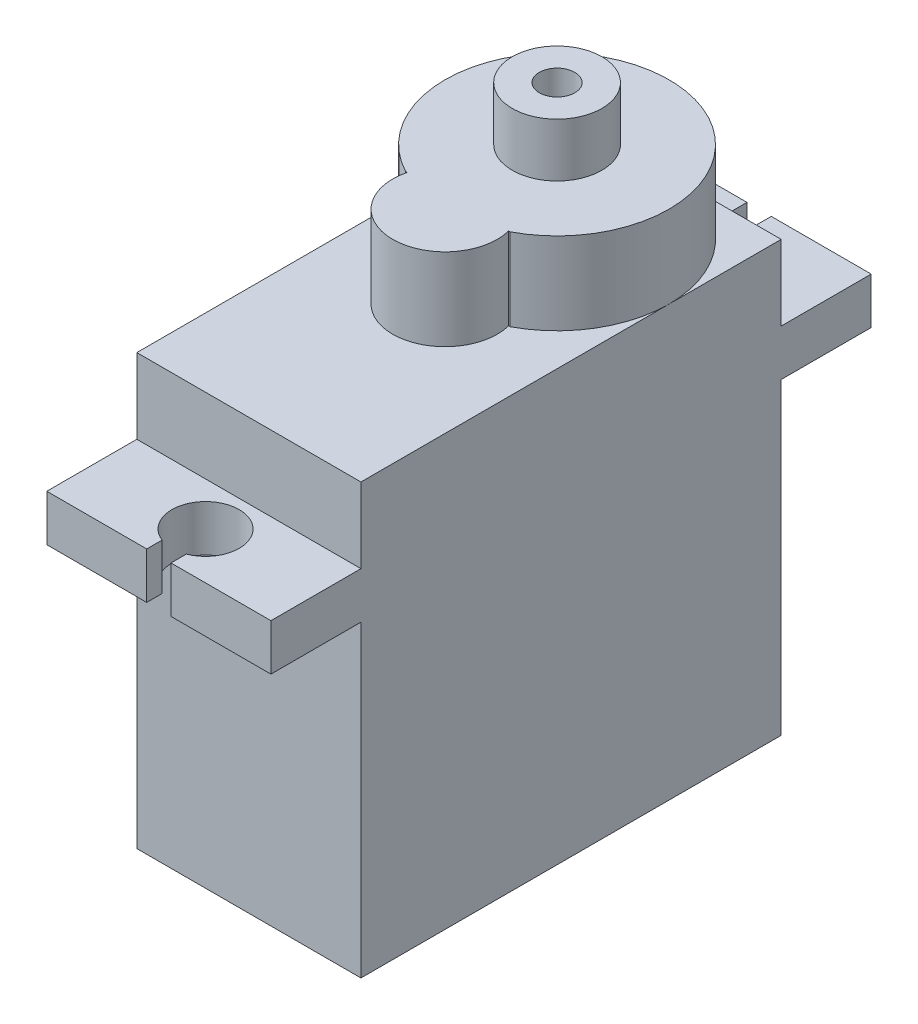
ISO-10303-21;
HEADER;
FILE_DESCRIPTION(('STEP AP214'),'2;1');
FILE_NAME('part.step','',(''),(''),'','','');
FILE_SCHEMA(('AUTOMOTIVE_DESIGN { 1 0 10303 214 1 1 1 1 }'));
ENDSEC;
DATA;
#1=APPLICATION_CONTEXT('core data for automotive mechanical design processes');
#2=APPLICATION_PROTOCOL_DEFINITION('international standard','automotive_design',2000,#1);
#3=PRODUCT_CONTEXT('',#1,'mechanical');
#4=PRODUCT('Part','Part','',(#3));
#5=PRODUCT_RELATED_PRODUCT_CATEGORY('part','',(#4));
#6=PRODUCT_DEFINITION_FORMATION('','',#4);
#7=PRODUCT_DEFINITION_CONTEXT('part definition',#1,'design');
#8=PRODUCT_DEFINITION('design','',#6,#7);
#9=PRODUCT_DEFINITION_SHAPE('','',#8);
#10=(LENGTH_UNIT() NAMED_UNIT(*) SI_UNIT(.MILLI.,.METRE.));
#11=(NAMED_UNIT(*) PLANE_ANGLE_UNIT() SI_UNIT($,.RADIAN.));
#12=(NAMED_UNIT(*) SI_UNIT($,.STERADIAN.) SOLID_ANGLE_UNIT());
#13=UNCERTAINTY_MEASURE_WITH_UNIT(LENGTH_MEASURE(1.E-05),#10,'distance_accuracy_value','');
#14=(GEOMETRIC_REPRESENTATION_CONTEXT(3) GLOBAL_UNCERTAINTY_ASSIGNED_CONTEXT((#13)) GLOBAL_UNIT_ASSIGNED_CONTEXT((#10,
#11,#12)) REPRESENTATION_CONTEXT('',''));
#15=CARTESIAN_POINT('',(0.,0.,0.));
#16=DIRECTION('',(0.,0.,1.));
#17=DIRECTION('',(1.,0.,0.));
#18=AXIS2_PLACEMENT_3D('',#15,#16,#17);
#19=CARTESIAN_POINT('',(0.,0.,-16.07));
#20=DIRECTION('',(0.,0.,-1.));
#21=DIRECTION('',(0.,1.,0.));
#22=AXIS2_PLACEMENT_3D('',#19,#20,#21);
#23=PLANE('',#22);
#24=DIRECTION('',(-1.,0.,0.));
#25=VECTOR('',#24,1.);
#26=CARTESIAN_POINT('',(0.,5.00000000000001,-16.07));
#27=LINE('',#26,#25);
#28=CARTESIAN_POINT('',(12.,5.00000000000001,-16.07));
#29=VERTEX_POINT('',#28);
#30=CARTESIAN_POINT('',(6.65,5.00000000000001,-16.07));
#31=VERTEX_POINT('',#30);
#32=EDGE_CURVE('E342',#29,#31,#27,.T.);
#33=ORIENTED_EDGE('',*,*,#32,.T.);
#34=DIRECTION('',(0.,1.,0.));
#35=VECTOR('',#34,1.);
#36=CARTESIAN_POINT('',(6.65,4.99000000000001,-16.07));
#37=LINE('',#36,#35);
#38=CARTESIAN_POINT('',(6.65,7.48000000000001,-16.07));
#39=VERTEX_POINT('',#38);
#40=EDGE_CURVE('E97',#31,#39,#37,.T.);
#41=ORIENTED_EDGE('',*,*,#40,.T.);
#42=DIRECTION('',(-1.,0.,0.));
#43=VECTOR('',#42,1.);
#44=CARTESIAN_POINT('',(0.,7.48000000000001,-16.07));
#45=LINE('',#44,#43);
#46=CARTESIAN_POINT('',(12.,7.48000000000001,-16.07));
#47=VERTEX_POINT('',#46);
#48=EDGE_CURVE('E275',#47,#39,#45,.T.);
#49=ORIENTED_EDGE('',*,*,#48,.F.);
#50=DIRECTION('',(0.,-1.,0.));
#51=VECTOR('',#50,1.);
#52=CARTESIAN_POINT('',(12.,0.,-16.07));
#53=LINE('',#52,#51);
#54=EDGE_CURVE('E338',#47,#29,#53,.T.);
#55=ORIENTED_EDGE('',*,*,#54,.T.);
#56=EDGE_LOOP('',(#33,#41,#49,#55));
#57=FACE_BOUND('',#56,.T.);
#58=ADVANCED_FACE('F85',(#57),#23,.T.);
#59=CARTESIAN_POINT('',(0.,7.48000000000001,-16.07));
#60=DIRECTION('',(0.,1.,0.));
#61=DIRECTION('',(0.,0.,1.));
#62=AXIS2_PLACEMENT_3D('',#59,#60,#61);
#63=PLANE('',#62);
#64=ORIENTED_EDGE('',*,*,#48,.T.);
#65=DIRECTION('',(0.,0.,1.));
#66=VECTOR('',#65,1.);
#67=CARTESIAN_POINT('',(6.64999999999997,7.48000000000001,16.07));
#68=LINE('',#67,#66);
#69=CARTESIAN_POINT('',(6.65,7.48000000000001,-15.2485410331594));
#70=VERTEX_POINT('',#69);
#71=EDGE_CURVE('E251',#39,#70,#68,.T.);
#72=ORIENTED_EDGE('',*,*,#71,.T.);
#73=CARTESIAN_POINT('',(6.,7.48000000000001,-13.57));
#74=DIRECTION('',(0.,1.,0.));
#75=DIRECTION('',(0.,0.,1.));
#76=AXIS2_PLACEMENT_3D('',#73,#74,#75);
#77=CIRCLE('',#76,1.80000000000001);
#78=CARTESIAN_POINT('',(5.35,7.48000000000001,-15.2485410331595));
#79=VERTEX_POINT('',#78);
#80=EDGE_CURVE('E262',#79,#70,#77,.T.);
#81=ORIENTED_EDGE('',*,*,#80,.F.);
#82=DIRECTION('',(0.,0.,1.));
#83=VECTOR('',#82,1.);
#84=CARTESIAN_POINT('',(5.34999999999993,7.48000000000001,16.07));
#85=LINE('',#84,#83);
#86=CARTESIAN_POINT('',(5.35,7.48000000000001,-16.07));
#87=VERTEX_POINT('',#86);
#88=EDGE_CURVE('E256',#87,#79,#85,.T.);
#89=ORIENTED_EDGE('',*,*,#88,.F.);
#90=CARTESIAN_POINT('',(0.,7.48000000000001,-16.07));
#91=VERTEX_POINT('',#90);
#92=EDGE_CURVE('E343',#87,#91,#45,.T.);
#93=ORIENTED_EDGE('',*,*,#92,.T.);
#94=DIRECTION('',(0.,0.,1.));
#95=VECTOR('',#94,1.);
#96=CARTESIAN_POINT('',(0.,7.48000000000001,-16.07));
#97=LINE('',#96,#95);
#98=CARTESIAN_POINT('',(0.,7.48000000000001,-11.25));
#99=VERTEX_POINT('',#98);
#100=EDGE_CURVE('E348',#91,#99,#97,.T.);
#101=ORIENTED_EDGE('',*,*,#100,.T.);
#102=DIRECTION('',(-1.,0.,0.));
#103=VECTOR('',#102,1.);
#104=CARTESIAN_POINT('',(0.,7.48000000000001,-11.25));
#105=LINE('',#104,#103);
#106=CARTESIAN_POINT('',(12.,7.48000000000001,-11.25));
#107=VERTEX_POINT('',#106);
#108=EDGE_CURVE('E336',#107,#99,#105,.T.);
#109=ORIENTED_EDGE('',*,*,#108,.F.);
#110=DIRECTION('',(0.,0.,1.));
#111=VECTOR('',#110,1.);
#112=CARTESIAN_POINT('',(12.,7.48000000000001,-16.07));
#113=LINE('',#112,#111);
#114=EDGE_CURVE('E361',#47,#107,#113,.T.);
#115=ORIENTED_EDGE('',*,*,#114,.F.);
#116=EDGE_LOOP('',(#64,#72,#81,#89,#93,#101,#109,#115));
#117=FACE_BOUND('',#116,.T.);
#118=ADVANCED_FACE('F267',(#117),#63,.T.);
#119=CARTESIAN_POINT('',(0.,0.,16.07));
#120=DIRECTION('',(0.,0.,1.));
#121=DIRECTION('',(1.,0.,0.));
#122=AXIS2_PLACEMENT_3D('',#119,#120,#121);
#123=PLANE('',#122);
#124=DIRECTION('',(1.,0.,0.));
#125=VECTOR('',#124,1.);
#126=CARTESIAN_POINT('',(0.,5.00000000000001,16.07));
#127=LINE('',#126,#125);
#128=CARTESIAN_POINT('',(0.,5.00000000000001,16.07));
#129=VERTEX_POINT('',#128);
#130=CARTESIAN_POINT('',(5.35,5.00000000000001,16.07));
#131=VERTEX_POINT('',#130);
#132=EDGE_CURVE('E372',#129,#131,#127,.T.);
#133=ORIENTED_EDGE('',*,*,#132,.T.);
#134=DIRECTION('',(0.,1.,0.));
#135=VECTOR('',#134,1.);
#136=CARTESIAN_POINT('',(5.35,4.99000000000001,16.07));
#137=LINE('',#136,#135);
#138=CARTESIAN_POINT('',(5.35,7.48000000000001,16.07));
#139=VERTEX_POINT('',#138);
#140=EDGE_CURVE('E289',#131,#139,#137,.T.);
#141=ORIENTED_EDGE('',*,*,#140,.T.);
#142=DIRECTION('',(1.,0.,0.));
#143=VECTOR('',#142,1.);
#144=CARTESIAN_POINT('',(0.,7.48000000000001,16.07));
#145=LINE('',#144,#143);
#146=CARTESIAN_POINT('',(0.,7.48000000000001,16.07));
#147=VERTEX_POINT('',#146);
#148=EDGE_CURVE('E370',#147,#139,#145,.T.);
#149=ORIENTED_EDGE('',*,*,#148,.F.);
#150=DIRECTION('',(0.,-1.,0.));
#151=VECTOR('',#150,1.);
#152=CARTESIAN_POINT('',(0.,0.,16.07));
#153=LINE('',#152,#151);
#154=EDGE_CURVE('E369',#147,#129,#153,.T.);
#155=ORIENTED_EDGE('',*,*,#154,.T.);
#156=EDGE_LOOP('',(#133,#141,#149,#155));
#157=FACE_BOUND('',#156,.T.);
#158=ADVANCED_FACE('F492',(#157),#123,.T.);
#159=CARTESIAN_POINT('',(0.,7.48000000000001,16.07));
#160=DIRECTION('',(0.,1.,0.));
#161=DIRECTION('',(0.,0.,1.));
#162=AXIS2_PLACEMENT_3D('',#159,#160,#161);
#163=PLANE('',#162);
#164=ORIENTED_EDGE('',*,*,#148,.T.);
#165=DIRECTION('',(0.,0.,-1.));
#166=VECTOR('',#165,1.);
#167=CARTESIAN_POINT('',(5.35,7.48000000000001,16.07));
#168=LINE('',#167,#166);
#169=CARTESIAN_POINT('',(5.35,7.48000000000001,15.2485410331595));
#170=VERTEX_POINT('',#169);
#171=EDGE_CURVE('E280',#139,#170,#168,.T.);
#172=ORIENTED_EDGE('',*,*,#171,.T.);
#173=CARTESIAN_POINT('',(6.,7.48000000000001,13.57));
#174=DIRECTION('',(0.,1.,0.));
#175=DIRECTION('',(0.,0.,1.));
#176=AXIS2_PLACEMENT_3D('',#173,#174,#175);
#177=CIRCLE('',#176,1.80000000000001);
#178=CARTESIAN_POINT('',(6.65,7.48000000000001,15.2485410331595));
#179=VERTEX_POINT('',#178);
#180=EDGE_CURVE('E285',#179,#170,#177,.T.);
#181=ORIENTED_EDGE('',*,*,#180,.F.);
#182=DIRECTION('',(0.,0.,-1.));
#183=VECTOR('',#182,1.);
#184=CARTESIAN_POINT('',(6.65,7.48000000000001,16.07));
#185=LINE('',#184,#183);
#186=CARTESIAN_POINT('',(6.65,7.48000000000001,16.07));
#187=VERTEX_POINT('',#186);
#188=EDGE_CURVE('E287',#187,#179,#185,.T.);
#189=ORIENTED_EDGE('',*,*,#188,.F.);
#190=CARTESIAN_POINT('',(12.,7.48000000000001,16.07));
#191=VERTEX_POINT('',#190);
#192=EDGE_CURVE('E371',#187,#191,#145,.T.);
#193=ORIENTED_EDGE('',*,*,#192,.T.);
#194=DIRECTION('',(0.,0.,-1.));
#195=VECTOR('',#194,1.);
#196=CARTESIAN_POINT('',(12.,7.48000000000001,16.07));
#197=LINE('',#196,#195);
#198=CARTESIAN_POINT('',(12.,7.48000000000001,11.25));
#199=VERTEX_POINT('',#198);
#200=EDGE_CURVE('E379',#191,#199,#197,.T.);
#201=ORIENTED_EDGE('',*,*,#200,.T.);
#202=DIRECTION('',(1.,0.,0.));
#203=VECTOR('',#202,1.);
#204=CARTESIAN_POINT('',(0.,7.48000000000001,11.25));
#205=LINE('',#204,#203);
#206=CARTESIAN_POINT('',(0.,7.48000000000001,11.25));
#207=VERTEX_POINT('',#206);
#208=EDGE_CURVE('E366',#207,#199,#205,.T.);
#209=ORIENTED_EDGE('',*,*,#208,.F.);
#210=DIRECTION('',(0.,0.,-1.));
#211=VECTOR('',#210,1.);
#212=CARTESIAN_POINT('',(0.,7.48000000000001,16.07));
#213=LINE('',#212,#211);
#214=EDGE_CURVE('E395',#147,#207,#213,.T.);
#215=ORIENTED_EDGE('',*,*,#214,.F.);
#216=EDGE_LOOP('',(#164,#172,#181,#189,#193,#201,#209,#215));
#217=FACE_BOUND('',#216,.T.);
#218=ADVANCED_FACE('F501',(#217),#163,.T.);
#219=CARTESIAN_POINT('',(0.,5.00000000000001,16.07));
#220=DIRECTION('',(0.,1.,0.));
#221=DIRECTION('',(0.,0.,1.));
#222=AXIS2_PLACEMENT_3D('',#219,#220,#221);
#223=PLANE('',#222);
#224=DIRECTION('',(0.,0.,-1.));
#225=VECTOR('',#224,1.);
#226=CARTESIAN_POINT('',(5.35,5.00000000000001,16.07));
#227=LINE('',#226,#225);
#228=CARTESIAN_POINT('',(5.35,5.00000000000001,15.2485410331595));
#229=VERTEX_POINT('',#228);
#230=EDGE_CURVE('E443',#131,#229,#227,.T.);
#231=ORIENTED_EDGE('',*,*,#230,.F.);
#232=ORIENTED_EDGE('',*,*,#132,.F.);
#233=DIRECTION('',(0.,0.,-1.));
#234=VECTOR('',#233,1.);
#235=CARTESIAN_POINT('',(0.,5.00000000000001,16.07));
#236=LINE('',#235,#234);
#237=CARTESIAN_POINT('',(0.,5.00000000000001,11.25));
#238=VERTEX_POINT('',#237);
#239=EDGE_CURVE('E389',#129,#238,#236,.T.);
#240=ORIENTED_EDGE('',*,*,#239,.T.);
#241=DIRECTION('',(1.,0.,0.));
#242=VECTOR('',#241,1.);
#243=CARTESIAN_POINT('',(0.,5.00000000000001,11.25));
#244=LINE('',#243,#242);
#245=CARTESIAN_POINT('',(12.,5.00000000000001,11.25));
#246=VERTEX_POINT('',#245);
#247=EDGE_CURVE('E385',#238,#246,#244,.T.);
#248=ORIENTED_EDGE('',*,*,#247,.T.);
#249=DIRECTION('',(0.,0.,-1.));
#250=VECTOR('',#249,1.);
#251=CARTESIAN_POINT('',(12.,5.00000000000001,16.07));
#252=LINE('',#251,#250);
#253=CARTESIAN_POINT('',(12.,5.00000000000001,16.07));
#254=VERTEX_POINT('',#253);
#255=EDGE_CURVE('E390',#254,#246,#252,.T.);
#256=ORIENTED_EDGE('',*,*,#255,.F.);
#257=CARTESIAN_POINT('',(6.65,5.00000000000001,16.07));
#258=VERTEX_POINT('',#257);
#259=EDGE_CURVE('E373',#258,#254,#127,.T.);
#260=ORIENTED_EDGE('',*,*,#259,.F.);
#261=DIRECTION('',(0.,0.,-1.));
#262=VECTOR('',#261,1.);
#263=CARTESIAN_POINT('',(6.65,5.00000000000001,16.07));
#264=LINE('',#263,#262);
#265=CARTESIAN_POINT('',(6.65,5.00000000000001,15.2485410331595));
#266=VERTEX_POINT('',#265);
#267=EDGE_CURVE('E438',#258,#266,#264,.T.);
#268=ORIENTED_EDGE('',*,*,#267,.T.);
#269=CARTESIAN_POINT('',(6.,5.00000000000001,13.57));
#270=DIRECTION('',(0.,1.,0.));
#271=DIRECTION('',(0.,0.,1.));
#272=AXIS2_PLACEMENT_3D('',#269,#270,#271);
#273=CIRCLE('',#272,1.80000000000001);
#274=EDGE_CURVE('E441',#266,#229,#273,.T.);
#275=ORIENTED_EDGE('',*,*,#274,.T.);
#276=EDGE_LOOP('',(#231,#232,#240,#248,#256,#260,#268,#275));
#277=FACE_BOUND('',#276,.T.);
#278=ADVANCED_FACE('F495',(#277),#223,.F.);
#279=CARTESIAN_POINT('',(12.,11.5,11.25));
#280=DIRECTION('',(0.,-1.,0.));
#281=DIRECTION('',(0.,0.,-1.));
#282=AXIS2_PLACEMENT_3D('',#279,#280,#281);
#283=PLANE('',#282);
#284=DIRECTION('',(1.,0.,0.));
#285=VECTOR('',#284,1.);
#286=CARTESIAN_POINT('',(12.,11.5,0.0565996645686233));
#287=LINE('',#286,#285);
#288=CARTESIAN_POINT('',(8.7127838053969,11.5,0.0565996645686231));
#289=VERTEX_POINT('',#288);
#290=CARTESIAN_POINT('',(8.8,11.5,0.056599664568632));
#291=VERTEX_POINT('',#290);
#292=EDGE_CURVE('E304',#289,#291,#287,.T.);
#293=ORIENTED_EDGE('',*,*,#292,.F.);
#294=CARTESIAN_POINT('',(6.,11.5,0.74999999999999));
#295=DIRECTION('',(0.,-1.,0.));
#296=DIRECTION('',(0.,0.,-1.));
#297=AXIS2_PLACEMENT_3D('',#294,#295,#296);
#298=CIRCLE('',#297,2.8);
#299=CARTESIAN_POINT('',(3.2872161946031,11.5,0.0565996645686244));
#300=VERTEX_POINT('',#299);
#301=EDGE_CURVE('E307',#289,#300,#298,.T.);
#302=ORIENTED_EDGE('',*,*,#301,.T.);
#303=DIRECTION('',(1.,0.,0.));
#304=VECTOR('',#303,1.);
#305=CARTESIAN_POINT('',(12.,11.5,0.0565996645686233));
#306=LINE('',#305,#304);
#307=CARTESIAN_POINT('',(3.19999999999999,11.5,0.0565996645686233));
#308=VERTEX_POINT('',#307);
#309=EDGE_CURVE('E321',#308,#300,#306,.T.);
#310=ORIENTED_EDGE('',*,*,#309,.F.);
#311=CARTESIAN_POINT('',(5.99999999999999,11.5,-5.25000000000002));
#312=DIRECTION('',(0.,-1.,0.));
#313=DIRECTION('',(0.,0.,-1.));
#314=AXIS2_PLACEMENT_3D('',#311,#312,#313);
#315=CIRCLE('',#314,6.00000000000001);
#316=CARTESIAN_POINT('',(0.,11.5,-5.25000000000002));
#317=VERTEX_POINT('',#316);
#318=EDGE_CURVE('E318',#308,#317,#315,.T.);
#319=ORIENTED_EDGE('',*,*,#318,.T.);
#320=DIRECTION('',(0.,0.,1.));
#321=VECTOR('',#320,1.);
#322=CARTESIAN_POINT('',(0.,11.5,11.25));
#323=LINE('',#322,#321);
#324=CARTESIAN_POINT('',(0.,11.5,11.25));
#325=VERTEX_POINT('',#324);
#326=EDGE_CURVE('E411',#317,#325,#323,.T.);
#327=ORIENTED_EDGE('',*,*,#326,.T.);
#328=DIRECTION('',(-1.,0.,0.));
#329=VECTOR('',#328,1.);
#330=CARTESIAN_POINT('',(12.,11.5,11.25));
#331=LINE('',#330,#329);
#332=CARTESIAN_POINT('',(12.,11.5,11.25));
#333=VERTEX_POINT('',#332);
#334=EDGE_CURVE('E426',#333,#325,#331,.T.);
#335=ORIENTED_EDGE('',*,*,#334,.F.);
#336=DIRECTION('',(0.,0.,1.));
#337=VECTOR('',#336,1.);
#338=CARTESIAN_POINT('',(12.,11.5,11.25));
#339=LINE('',#338,#337);
#340=CARTESIAN_POINT('',(12.,11.5,-5.25000000000002));
#341=VERTEX_POINT('',#340);
#342=EDGE_CURVE('E397',#341,#333,#339,.T.);
#343=ORIENTED_EDGE('',*,*,#342,.F.);
#344=EDGE_CURVE('E324',#341,#291,#315,.T.);
#345=ORIENTED_EDGE('',*,*,#344,.T.);
#346=EDGE_LOOP('',(#293,#302,#310,#319,#327,#335,#343,#345));
#347=FACE_BOUND('',#346,.T.);
#348=ADVANCED_FACE('F515',(#347),#283,.F.);
#349=CARTESIAN_POINT('',(0.,11.5,-11.25));
#350=VERTEX_POINT('',#349);
#351=EDGE_CURVE('E413',#350,#317,#323,.T.);
#352=ORIENTED_EDGE('',*,*,#351,.T.);
#353=CARTESIAN_POINT('',(5.99999999999999,11.5,-11.25));
#354=VERTEX_POINT('',#353);
#355=EDGE_CURVE('E322',#317,#354,#315,.T.);
#356=ORIENTED_EDGE('',*,*,#355,.T.);
#357=DIRECTION('',(-1.,0.,0.));
#358=VECTOR('',#357,1.);
#359=CARTESIAN_POINT('',(12.,11.5,-11.25));
#360=LINE('',#359,#358);
#361=EDGE_CURVE('E431',#354,#350,#360,.T.);
#362=ORIENTED_EDGE('',*,*,#361,.T.);
#363=EDGE_LOOP('',(#352,#356,#362));
#364=FACE_BOUND('',#363,.T.);
#365=ADVANCED_FACE('F520',(#364),#283,.F.);
#366=CARTESIAN_POINT('',(12.,11.5,-11.25));
#367=DIRECTION('',(0.,0.,1.));
#368=DIRECTION('',(0.,-1.,0.));
#369=AXIS2_PLACEMENT_3D('',#366,#367,#368);
#370=PLANE('',#369);
#371=DIRECTION('',(-1.,0.,0.));
#372=VECTOR('',#371,1.);
#373=CARTESIAN_POINT('',(0.,5.00000000000001,-11.25));
#374=LINE('',#373,#372);
#375=CARTESIAN_POINT('',(12.,5.00000000000001,-11.25));
#376=VERTEX_POINT('',#375);
#377=CARTESIAN_POINT('',(0.,5.00000000000001,-11.25));
#378=VERTEX_POINT('',#377);
#379=EDGE_CURVE('E355',#376,#378,#374,.T.);
#380=ORIENTED_EDGE('',*,*,#379,.F.);
#381=DIRECTION('',(0.,1.,0.));
#382=VECTOR('',#381,1.);
#383=CARTESIAN_POINT('',(12.,11.5,-11.25));
#384=LINE('',#383,#382);
#385=CARTESIAN_POINT('',(12.,-11.5,-11.25));
#386=VERTEX_POINT('',#385);
#387=EDGE_CURVE('E396',#386,#376,#384,.T.);
#388=ORIENTED_EDGE('',*,*,#387,.F.);
#389=DIRECTION('',(-1.,0.,0.));
#390=VECTOR('',#389,1.);
#391=CARTESIAN_POINT('',(12.,-11.5,-11.25));
#392=LINE('',#391,#390);
#393=CARTESIAN_POINT('',(0.,-11.5,-11.25));
#394=VERTEX_POINT('',#393);
#395=EDGE_CURVE('E412',#386,#394,#392,.T.);
#396=ORIENTED_EDGE('',*,*,#395,.T.);
#397=DIRECTION('',(0.,1.,0.));
#398=VECTOR('',#397,1.);
#399=CARTESIAN_POINT('',(0.,11.5,-11.25));
#400=LINE('',#399,#398);
#401=EDGE_CURVE('E414',#394,#378,#400,.T.);
#402=ORIENTED_EDGE('',*,*,#401,.T.);
#403=EDGE_LOOP('',(#380,#388,#396,#402));
#404=FACE_BOUND('',#403,.T.);
#405=ADVANCED_FACE('F476',(#404),#370,.F.);
#406=CARTESIAN_POINT('',(12.,11.5,11.25));
#407=DIRECTION('',(0.,0.,-1.));
#408=DIRECTION('',(0.,1.,0.));
#409=AXIS2_PLACEMENT_3D('',#406,#407,#408);
#410=PLANE('',#409);
#411=ORIENTED_EDGE('',*,*,#247,.F.);
#412=DIRECTION('',(0.,-1.,0.));
#413=VECTOR('',#412,1.);
#414=CARTESIAN_POINT('',(0.,11.5,11.25));
#415=LINE('',#414,#413);
#416=CARTESIAN_POINT('',(0.,-11.5,11.25));
#417=VERTEX_POINT('',#416);
#418=EDGE_CURVE('E419',#238,#417,#415,.T.);
#419=ORIENTED_EDGE('',*,*,#418,.T.);
#420=DIRECTION('',(-1.,0.,0.));
#421=VECTOR('',#420,1.);
#422=CARTESIAN_POINT('',(12.,-11.5,11.25));
#423=LINE('',#422,#421);
#424=CARTESIAN_POINT('',(12.,-11.5,11.25));
#425=VERTEX_POINT('',#424);
#426=EDGE_CURVE('E424',#425,#417,#423,.T.);
#427=ORIENTED_EDGE('',*,*,#426,.F.);
#428=DIRECTION('',(0.,-1.,0.));
#429=VECTOR('',#428,1.);
#430=CARTESIAN_POINT('',(12.,11.5,11.25));
#431=LINE('',#430,#429);
#432=EDGE_CURVE('E403',#246,#425,#431,.T.);
#433=ORIENTED_EDGE('',*,*,#432,.F.);
#434=EDGE_LOOP('',(#411,#419,#427,#433));
#435=FACE_BOUND('',#434,.T.);
#436=ADVANCED_FACE('F488',(#435),#410,.F.);
#437=CARTESIAN_POINT('',(12.,11.5,-11.25));
#438=VERTEX_POINT('',#437);
#439=EDGE_CURVE('E402',#107,#438,#384,.T.);
#440=ORIENTED_EDGE('',*,*,#439,.F.);
#441=ORIENTED_EDGE('',*,*,#108,.T.);
#442=EDGE_CURVE('E399',#99,#350,#400,.T.);
#443=ORIENTED_EDGE('',*,*,#442,.T.);
#444=ORIENTED_EDGE('',*,*,#361,.F.);
#445=EDGE_CURVE('E435',#438,#354,#360,.T.);
#446=ORIENTED_EDGE('',*,*,#445,.F.);
#447=EDGE_LOOP('',(#440,#441,#443,#444,#446));
#448=FACE_BOUND('',#447,.T.);
#449=ADVANCED_FACE('F82',(#448),#370,.F.);
#450=ORIENTED_EDGE('',*,*,#445,.T.);
#451=EDGE_CURVE('E522',#354,#341,#315,.T.);
#452=ORIENTED_EDGE('',*,*,#451,.T.);
#453=EDGE_CURVE('E405',#438,#341,#339,.T.);
#454=ORIENTED_EDGE('',*,*,#453,.F.);
#455=EDGE_LOOP('',(#450,#452,#454));
#456=FACE_BOUND('',#455,.T.);
#457=ADVANCED_FACE('F519',(#456),#283,.F.);
#458=EDGE_CURVE('E416',#325,#207,#415,.T.);
#459=ORIENTED_EDGE('',*,*,#458,.T.);
#460=ORIENTED_EDGE('',*,*,#208,.T.);
#461=EDGE_CURVE('E408',#333,#199,#431,.T.);
#462=ORIENTED_EDGE('',*,*,#461,.F.);
#463=ORIENTED_EDGE('',*,*,#334,.T.);
#464=EDGE_LOOP('',(#459,#460,#462,#463));
#465=FACE_BOUND('',#464,.T.);
#466=ADVANCED_FACE('F504',(#465),#410,.F.);
#467=CARTESIAN_POINT('',(12.,-11.5,11.25));
#468=DIRECTION('',(0.,1.,0.));
#469=DIRECTION('',(0.,0.,1.));
#470=AXIS2_PLACEMENT_3D('',#467,#468,#469);
#471=PLANE('',#470);
#472=DIRECTION('',(0.,0.,-1.));
#473=VECTOR('',#472,1.);
#474=CARTESIAN_POINT('',(0.,-11.5,11.25));
#475=LINE('',#474,#473);
#476=EDGE_CURVE('E423',#417,#394,#475,.T.);
#477=ORIENTED_EDGE('',*,*,#476,.T.);
#478=ORIENTED_EDGE('',*,*,#395,.F.);
#479=DIRECTION('',(0.,0.,-1.));
#480=VECTOR('',#479,1.);
#481=CARTESIAN_POINT('',(12.,-11.5,11.25));
#482=LINE('',#481,#480);
#483=EDGE_CURVE('E407',#425,#386,#482,.T.);
#484=ORIENTED_EDGE('',*,*,#483,.F.);
#485=ORIENTED_EDGE('',*,*,#426,.T.);
#486=EDGE_LOOP('',(#477,#478,#484,#485));
#487=FACE_BOUND('',#486,.T.);
#488=ADVANCED_FACE('F484',(#487),#471,.F.);
#489=CARTESIAN_POINT('',(12.,0.,0.));
#490=DIRECTION('',(1.,0.,0.));
#491=DIRECTION('',(0.,0.,-1.));
#492=AXIS2_PLACEMENT_3D('',#489,#490,#491);
#493=PLANE('',#492);
#494=ORIENTED_EDGE('',*,*,#387,.T.);
#495=DIRECTION('',(0.,0.,1.));
#496=VECTOR('',#495,1.);
#497=CARTESIAN_POINT('',(12.,5.00000000000001,-16.07));
#498=LINE('',#497,#496);
#499=EDGE_CURVE('E359',#29,#376,#498,.T.);
#500=ORIENTED_EDGE('',*,*,#499,.F.);
#501=ORIENTED_EDGE('',*,*,#54,.F.);
#502=ORIENTED_EDGE('',*,*,#114,.T.);
#503=ORIENTED_EDGE('',*,*,#439,.T.);
#504=ORIENTED_EDGE('',*,*,#453,.T.);
#505=ORIENTED_EDGE('',*,*,#342,.T.);
#506=ORIENTED_EDGE('',*,*,#461,.T.);
#507=ORIENTED_EDGE('',*,*,#200,.F.);
#508=DIRECTION('',(0.,1.,0.));
#509=VECTOR('',#508,1.);
#510=CARTESIAN_POINT('',(12.,0.,16.07));
#511=LINE('',#510,#509);
#512=EDGE_CURVE('E380',#254,#191,#511,.T.);
#513=ORIENTED_EDGE('',*,*,#512,.F.);
#514=ORIENTED_EDGE('',*,*,#255,.T.);
#515=ORIENTED_EDGE('',*,*,#432,.T.);
#516=ORIENTED_EDGE('',*,*,#483,.T.);
#517=EDGE_LOOP('',(#494,#500,#501,#502,#503,#504,#505,#506,#507,#513,#514,#515,#516));
#518=FACE_BOUND('',#517,.T.);
#519=ADVANCED_FACE('F475',(#518),#493,.T.);
#520=CARTESIAN_POINT('',(0.,0.,0.));
#521=DIRECTION('',(1.,0.,0.));
#522=DIRECTION('',(0.,0.,-1.));
#523=AXIS2_PLACEMENT_3D('',#520,#521,#522);
#524=PLANE('',#523);
#525=ORIENTED_EDGE('',*,*,#401,.F.);
#526=ORIENTED_EDGE('',*,*,#476,.F.);
#527=ORIENTED_EDGE('',*,*,#418,.F.);
#528=ORIENTED_EDGE('',*,*,#239,.F.);
#529=ORIENTED_EDGE('',*,*,#154,.F.);
#530=ORIENTED_EDGE('',*,*,#214,.T.);
#531=ORIENTED_EDGE('',*,*,#458,.F.);
#532=ORIENTED_EDGE('',*,*,#326,.F.);
#533=ORIENTED_EDGE('',*,*,#351,.F.);
#534=ORIENTED_EDGE('',*,*,#442,.F.);
#535=ORIENTED_EDGE('',*,*,#100,.F.);
#536=DIRECTION('',(0.,1.,0.));
#537=VECTOR('',#536,1.);
#538=CARTESIAN_POINT('',(0.,0.,-16.07));
#539=LINE('',#538,#537);
#540=CARTESIAN_POINT('',(0.,5.00000000000001,-16.07));
#541=VERTEX_POINT('',#540);
#542=EDGE_CURVE('E349',#541,#91,#539,.T.);
#543=ORIENTED_EDGE('',*,*,#542,.F.);
#544=DIRECTION('',(0.,0.,1.));
#545=VECTOR('',#544,1.);
#546=CARTESIAN_POINT('',(0.,5.00000000000001,-16.07));
#547=LINE('',#546,#545);
#548=EDGE_CURVE('E357',#541,#378,#547,.T.);
#549=ORIENTED_EDGE('',*,*,#548,.T.);
#550=EDGE_LOOP('',(#525,#526,#527,#528,#529,#530,#531,#532,#533,#534,#535,#543,#549));
#551=FACE_BOUND('',#550,.T.);
#552=ADVANCED_FACE('F461',(#551),#524,.F.);
#553=DIRECTION('',(0.,1.,0.));
#554=VECTOR('',#553,1.);
#555=CARTESIAN_POINT('',(6.65,4.99000000000001,16.07));
#556=LINE('',#555,#554);
#557=EDGE_CURVE('E293',#258,#187,#556,.T.);
#558=ORIENTED_EDGE('',*,*,#557,.F.);
#559=ORIENTED_EDGE('',*,*,#259,.T.);
#560=ORIENTED_EDGE('',*,*,#512,.T.);
#561=ORIENTED_EDGE('',*,*,#192,.F.);
#562=EDGE_LOOP('',(#558,#559,#560,#561));
#563=FACE_BOUND('',#562,.T.);
#564=ADVANCED_FACE('F570',(#563),#123,.T.);
#565=CARTESIAN_POINT('',(0.,5.00000000000001,-16.07));
#566=DIRECTION('',(0.,1.,0.));
#567=DIRECTION('',(0.,0.,1.));
#568=AXIS2_PLACEMENT_3D('',#565,#566,#567);
#569=PLANE('',#568);
#570=CARTESIAN_POINT('',(5.35,5.00000000000001,-16.07));
#571=VERTEX_POINT('',#570);
#572=EDGE_CURVE('E341',#571,#541,#27,.T.);
#573=ORIENTED_EDGE('',*,*,#572,.F.);
#574=DIRECTION('',(0.,0.,1.));
#575=VECTOR('',#574,1.);
#576=CARTESIAN_POINT('',(5.35,5.00000000000001,-16.07));
#577=LINE('',#576,#575);
#578=CARTESIAN_POINT('',(5.35,5.00000000000001,-15.2485410331595));
#579=VERTEX_POINT('',#578);
#580=EDGE_CURVE('E12',#571,#579,#577,.T.);
#581=ORIENTED_EDGE('',*,*,#580,.T.);
#582=CARTESIAN_POINT('',(6.,5.00000000000001,-13.57));
#583=DIRECTION('',(0.,1.,0.));
#584=DIRECTION('',(0.,0.,1.));
#585=AXIS2_PLACEMENT_3D('',#582,#583,#584);
#586=CIRCLE('',#585,1.80000000000001);
#587=CARTESIAN_POINT('',(6.65,5.00000000000001,-15.2485410331594));
#588=VERTEX_POINT('',#587);
#589=EDGE_CURVE('E88',#579,#588,#586,.T.);
#590=ORIENTED_EDGE('',*,*,#589,.T.);
#591=DIRECTION('',(0.,0.,1.));
#592=VECTOR('',#591,1.);
#593=CARTESIAN_POINT('',(6.65,5.00000000000001,-16.07));
#594=LINE('',#593,#592);
#595=EDGE_CURVE('E253',#31,#588,#594,.T.);
#596=ORIENTED_EDGE('',*,*,#595,.F.);
#597=ORIENTED_EDGE('',*,*,#32,.F.);
#598=ORIENTED_EDGE('',*,*,#499,.T.);
#599=ORIENTED_EDGE('',*,*,#379,.T.);
#600=ORIENTED_EDGE('',*,*,#548,.F.);
#601=EDGE_LOOP('',(#573,#581,#590,#596,#597,#598,#599,#600));
#602=FACE_BOUND('',#601,.T.);
#603=ADVANCED_FACE('F449',(#602),#569,.F.);
#604=DIRECTION('',(0.,1.,0.));
#605=VECTOR('',#604,1.);
#606=CARTESIAN_POINT('',(5.35,4.99000000000001,-16.07));
#607=LINE('',#606,#605);
#608=EDGE_CURVE('E276',#571,#87,#607,.T.);
#609=ORIENTED_EDGE('',*,*,#608,.F.);
#610=ORIENTED_EDGE('',*,*,#572,.T.);
#611=ORIENTED_EDGE('',*,*,#542,.T.);
#612=ORIENTED_EDGE('',*,*,#92,.F.);
#613=EDGE_LOOP('',(#609,#610,#611,#612));
#614=FACE_BOUND('',#613,.T.);
#615=ADVANCED_FACE('F454',(#614),#23,.T.);
#616=CARTESIAN_POINT('',(6.,15.9,0.74999999999999));
#617=DIRECTION('',(0.,-1.,0.));
#618=DIRECTION('',(0.,0.,-1.));
#619=AXIS2_PLACEMENT_3D('',#616,#617,#618);
#620=CYLINDRICAL_SURFACE('',#619,2.8);
#621=ORIENTED_EDGE('',*,*,#301,.F.);
#622=DIRECTION('',(0.,-1.,0.));
#623=VECTOR('',#622,1.);
#624=CARTESIAN_POINT('',(8.7127838053969,15.9,0.0565996645686231));
#625=LINE('',#624,#623);
#626=CARTESIAN_POINT('',(8.7127838053969,15.9,0.0565996645686231));
#627=VERTEX_POINT('',#626);
#628=EDGE_CURVE('E319',#627,#289,#625,.T.);
#629=ORIENTED_EDGE('',*,*,#628,.F.);
#630=CARTESIAN_POINT('',(6.,15.9,0.74999999999999));
#631=DIRECTION('',(0.,-1.,0.));
#632=DIRECTION('',(0.,0.,-1.));
#633=AXIS2_PLACEMENT_3D('',#630,#631,#632);
#634=CIRCLE('',#633,2.8);
#635=CARTESIAN_POINT('',(3.2872161946031,15.9,0.0565996645686244));
#636=VERTEX_POINT('',#635);
#637=EDGE_CURVE('E314',#627,#636,#634,.T.);
#638=ORIENTED_EDGE('',*,*,#637,.T.);
#639=DIRECTION('',(0.,-1.,0.));
#640=VECTOR('',#639,1.);
#641=CARTESIAN_POINT('',(3.2872161946031,15.9,0.0565996645686244));
#642=LINE('',#641,#640);
#643=EDGE_CURVE('E334',#636,#300,#642,.T.);
#644=ORIENTED_EDGE('',*,*,#643,.T.);
#645=EDGE_LOOP('',(#621,#629,#638,#644));
#646=FACE_BOUND('',#645,.T.);
#647=ADVANCED_FACE('F535',(#646),#620,.T.);
#648=CARTESIAN_POINT('',(12.,15.9,0.0565996645686233));
#649=DIRECTION('',(0.,0.,-1.));
#650=DIRECTION('',(-1.,0.,0.));
#651=AXIS2_PLACEMENT_3D('',#648,#649,#650);
#652=PLANE('',#651);
#653=ORIENTED_EDGE('',*,*,#292,.T.);
#654=DIRECTION('',(0.,-1.,0.));
#655=VECTOR('',#654,1.);
#656=CARTESIAN_POINT('',(8.8,15.9,0.056599664568632));
#657=LINE('',#656,#655);
#658=CARTESIAN_POINT('',(8.8,15.9,0.056599664568632));
#659=VERTEX_POINT('',#658);
#660=EDGE_CURVE('E332',#659,#291,#657,.T.);
#661=ORIENTED_EDGE('',*,*,#660,.F.);
#662=DIRECTION('',(1.,0.,0.));
#663=VECTOR('',#662,1.);
#664=CARTESIAN_POINT('',(12.,15.9,0.0565996645686233));
#665=LINE('',#664,#663);
#666=EDGE_CURVE('E306',#627,#659,#665,.T.);
#667=ORIENTED_EDGE('',*,*,#666,.F.);
#668=ORIENTED_EDGE('',*,*,#628,.T.);
#669=EDGE_LOOP('',(#653,#661,#667,#668));
#670=FACE_BOUND('',#669,.T.);
#671=ADVANCED_FACE('F530',(#670),#652,.F.);
#672=CARTESIAN_POINT('',(5.99999999999999,15.9,-5.25000000000002));
#673=DIRECTION('',(0.,-1.,0.));
#674=DIRECTION('',(0.,0.,-1.));
#675=AXIS2_PLACEMENT_3D('',#672,#673,#674);
#676=CYLINDRICAL_SURFACE('',#675,6.00000000000001);
#677=ORIENTED_EDGE('',*,*,#318,.F.);
#678=DIRECTION('',(0.,-1.,0.));
#679=VECTOR('',#678,1.);
#680=CARTESIAN_POINT('',(3.19999999999999,15.9,0.0565996645686233));
#681=LINE('',#680,#679);
#682=CARTESIAN_POINT('',(3.19999999999999,15.9,0.0565996645686233));
#683=VERTEX_POINT('',#682);
#684=EDGE_CURVE('E335',#683,#308,#681,.T.);
#685=ORIENTED_EDGE('',*,*,#684,.F.);
#686=CARTESIAN_POINT('',(5.99999999999999,15.9,-5.25000000000002));
#687=DIRECTION('',(0.,-1.,0.));
#688=DIRECTION('',(0.,0.,-1.));
#689=AXIS2_PLACEMENT_3D('',#686,#687,#688);
#690=CIRCLE('',#689,6.00000000000001);
#691=EDGE_CURVE('E308',#683,#659,#690,.T.);
#692=ORIENTED_EDGE('',*,*,#691,.T.);
#693=ORIENTED_EDGE('',*,*,#660,.T.);
#694=ORIENTED_EDGE('',*,*,#344,.F.);
#695=ORIENTED_EDGE('',*,*,#451,.F.);
#696=ORIENTED_EDGE('',*,*,#355,.F.);
#697=EDGE_LOOP('',(#677,#685,#692,#693,#694,#695,#696));
#698=FACE_BOUND('',#697,.T.);
#699=ADVANCED_FACE('F525',(#698),#676,.T.);
#700=CARTESIAN_POINT('',(12.,15.9,0.0565996645686233));
#701=DIRECTION('',(0.,0.,-1.));
#702=DIRECTION('',(-1.,0.,0.));
#703=AXIS2_PLACEMENT_3D('',#700,#701,#702);
#704=PLANE('',#703);
#705=ORIENTED_EDGE('',*,*,#309,.T.);
#706=ORIENTED_EDGE('',*,*,#643,.F.);
#707=DIRECTION('',(1.,0.,0.));
#708=VECTOR('',#707,1.);
#709=CARTESIAN_POINT('',(12.,15.9,0.0565996645686233));
#710=LINE('',#709,#708);
#711=EDGE_CURVE('E315',#683,#636,#710,.T.);
#712=ORIENTED_EDGE('',*,*,#711,.F.);
#713=ORIENTED_EDGE('',*,*,#684,.T.);
#714=EDGE_LOOP('',(#705,#706,#712,#713));
#715=FACE_BOUND('',#714,.T.);
#716=ADVANCED_FACE('F534',(#715),#704,.F.);
#717=CARTESIAN_POINT('',(5.99999999999999,15.9,-5.25000000000002));
#718=DIRECTION('',(0.,-1.,0.));
#719=DIRECTION('',(0.,0.,-1.));
#720=AXIS2_PLACEMENT_3D('',#717,#718,#719);
#721=PLANE('',#720);
#722=CARTESIAN_POINT('',(5.99999999999999,15.9,-5.25000000000002));
#723=DIRECTION('',(0.,-1.,0.));
#724=DIRECTION('',(0.,0.,-1.));
#725=AXIS2_PLACEMENT_3D('',#722,#723,#724);
#726=CIRCLE('',#725,2.4);
#727=CARTESIAN_POINT('',(5.99999999999999,15.9,-7.65000000000001));
#728=VERTEX_POINT('',#727);
#729=EDGE_CURVE('E305',#728,#728,#726,.T.);
#730=ORIENTED_EDGE('',*,*,#729,.T.);
#731=EDGE_LOOP('',(#730));
#732=FACE_BOUND('',#731,.T.);
#733=ORIENTED_EDGE('',*,*,#711,.T.);
#734=ORIENTED_EDGE('',*,*,#637,.F.);
#735=ORIENTED_EDGE('',*,*,#666,.T.);
#736=ORIENTED_EDGE('',*,*,#691,.F.);
#737=EDGE_LOOP('',(#733,#734,#735,#736));
#738=FACE_BOUND('',#737,.T.);
#739=ADVANCED_FACE('F540',(#732,#738),#721,.F.);
#740=CARTESIAN_POINT('',(5.99999999999999,18.77,-5.25000000000002));
#741=DIRECTION('',(0.,-1.,0.));
#742=DIRECTION('',(0.,0.,-1.));
#743=AXIS2_PLACEMENT_3D('',#740,#741,#742);
#744=CYLINDRICAL_SURFACE('',#743,2.4);
#745=CARTESIAN_POINT('',(5.99999999999999,18.77,-5.25000000000002));
#746=DIRECTION('',(0.,-1.,0.));
#747=DIRECTION('',(0.,0.,-1.));
#748=AXIS2_PLACEMENT_3D('',#745,#746,#747);
#749=CIRCLE('',#748,2.4);
#750=CARTESIAN_POINT('',(5.99999999999999,18.77,-7.65000000000001));
#751=VERTEX_POINT('',#750);
#752=EDGE_CURVE('E299',#751,#751,#749,.T.);
#753=ORIENTED_EDGE('',*,*,#752,.T.);
#754=EDGE_LOOP('',(#753));
#755=FACE_BOUND('',#754,.T.);
#756=ORIENTED_EDGE('',*,*,#729,.F.);
#757=EDGE_LOOP('',(#756));
#758=FACE_BOUND('',#757,.T.);
#759=ADVANCED_FACE('F537',(#755,#758),#744,.T.);
#760=CARTESIAN_POINT('',(5.99999999999999,18.77,-5.25000000000002));
#761=DIRECTION('',(0.,-1.,0.));
#762=DIRECTION('',(0.,0.,-1.));
#763=AXIS2_PLACEMENT_3D('',#760,#761,#762);
#764=PLANE('',#763);
#765=CARTESIAN_POINT('',(5.99999999999999,18.77,-5.25000000000002));
#766=DIRECTION('',(0.,-1.,0.));
#767=DIRECTION('',(0.,0.,-1.));
#768=AXIS2_PLACEMENT_3D('',#765,#766,#767);
#769=CIRCLE('',#768,0.949999999999999);
#770=CARTESIAN_POINT('',(5.99999999999999,18.77,-6.20000000000001));
#771=VERTEX_POINT('',#770);
#772=EDGE_CURVE('E298',#771,#771,#769,.T.);
#773=ORIENTED_EDGE('',*,*,#772,.T.);
#774=EDGE_LOOP('',(#773));
#775=FACE_BOUND('',#774,.T.);
#776=ORIENTED_EDGE('',*,*,#752,.F.);
#777=EDGE_LOOP('',(#776));
#778=FACE_BOUND('',#777,.T.);
#779=ADVANCED_FACE('F550',(#775,#778),#764,.F.);
#780=CARTESIAN_POINT('',(5.99999999999999,18.77,-5.25000000000002));
#781=DIRECTION('',(0.,-1.,0.));
#782=DIRECTION('',(0.,0.,-1.));
#783=AXIS2_PLACEMENT_3D('',#780,#781,#782);
#784=CYLINDRICAL_SURFACE('',#783,0.949999999999999);
#785=ORIENTED_EDGE('',*,*,#772,.F.);
#786=EDGE_LOOP('',(#785));
#787=FACE_BOUND('',#786,.T.);
#788=CARTESIAN_POINT('',(5.99999999999999,11.5,-5.25000000000002));
#789=DIRECTION('',(0.,-1.,0.));
#790=DIRECTION('',(0.,0.,-1.));
#791=AXIS2_PLACEMENT_3D('',#788,#789,#790);
#792=CIRCLE('',#791,0.949999999999999);
#793=CARTESIAN_POINT('',(5.99999999999999,11.5,-6.20000000000001));
#794=VERTEX_POINT('',#793);
#795=EDGE_CURVE('E434',#794,#794,#792,.T.);
#796=ORIENTED_EDGE('',*,*,#795,.T.);
#797=EDGE_LOOP('',(#796));
#798=FACE_BOUND('',#797,.T.);
#799=ADVANCED_FACE('F615',(#787,#798),#784,.F.);
#800=ORIENTED_EDGE('',*,*,#795,.F.);
#801=EDGE_LOOP('',(#800));
#802=FACE_BOUND('',#801,.T.);
#803=ADVANCED_FACE('F604',(#802),#283,.F.);
#804=CARTESIAN_POINT('',(5.35,4.99000000000001,16.07));
#805=DIRECTION('',(1.,0.,0.));
#806=DIRECTION('',(0.,0.,-1.));
#807=AXIS2_PLACEMENT_3D('',#804,#805,#806);
#808=PLANE('',#807);
#809=ORIENTED_EDGE('',*,*,#230,.T.);
#810=DIRECTION('',(0.,1.,0.));
#811=VECTOR('',#810,1.);
#812=CARTESIAN_POINT('',(5.35,4.99000000000001,15.2485410331595));
#813=LINE('',#812,#811);
#814=EDGE_CURVE('E295',#229,#170,#813,.T.);
#815=ORIENTED_EDGE('',*,*,#814,.T.);
#816=ORIENTED_EDGE('',*,*,#171,.F.);
#817=ORIENTED_EDGE('',*,*,#140,.F.);
#818=EDGE_LOOP('',(#809,#815,#816,#817));
#819=FACE_BOUND('',#818,.T.);
#820=ADVANCED_FACE('F612',(#819),#808,.T.);
#821=CARTESIAN_POINT('',(6.,4.99000000000001,13.57));
#822=DIRECTION('',(0.,1.,0.));
#823=DIRECTION('',(0.,0.,1.));
#824=AXIS2_PLACEMENT_3D('',#821,#822,#823);
#825=CYLINDRICAL_SURFACE('',#824,1.80000000000001);
#826=DIRECTION('',(0.,1.,0.));
#827=VECTOR('',#826,1.);
#828=CARTESIAN_POINT('',(6.65,4.99000000000001,15.2485410331595));
#829=LINE('',#828,#827);
#830=EDGE_CURVE('E102',#266,#179,#829,.T.);
#831=ORIENTED_EDGE('',*,*,#830,.T.);
#832=ORIENTED_EDGE('',*,*,#180,.T.);
#833=ORIENTED_EDGE('',*,*,#814,.F.);
#834=ORIENTED_EDGE('',*,*,#274,.F.);
#835=EDGE_LOOP('',(#831,#832,#833,#834));
#836=FACE_BOUND('',#835,.T.);
#837=ADVANCED_FACE('F677',(#836),#825,.F.);
#838=CARTESIAN_POINT('',(6.65,4.99000000000001,16.07));
#839=DIRECTION('',(1.,0.,0.));
#840=DIRECTION('',(0.,0.,-1.));
#841=AXIS2_PLACEMENT_3D('',#838,#839,#840);
#842=PLANE('',#841);
#843=ORIENTED_EDGE('',*,*,#557,.T.);
#844=ORIENTED_EDGE('',*,*,#188,.T.);
#845=ORIENTED_EDGE('',*,*,#830,.F.);
#846=ORIENTED_EDGE('',*,*,#267,.F.);
#847=EDGE_LOOP('',(#843,#844,#845,#846));
#848=FACE_BOUND('',#847,.T.);
#849=ADVANCED_FACE('F690',(#848),#842,.F.);
#850=CARTESIAN_POINT('',(6.,4.99000000000001,-13.57));
#851=DIRECTION('',(0.,1.,0.));
#852=DIRECTION('',(0.,0.,1.));
#853=AXIS2_PLACEMENT_3D('',#850,#851,#852);
#854=CYLINDRICAL_SURFACE('',#853,1.80000000000001);
#855=DIRECTION('',(0.,1.,0.));
#856=VECTOR('',#855,1.);
#857=CARTESIAN_POINT('',(5.35,4.99000000000001,-15.2485410331595));
#858=LINE('',#857,#856);
#859=EDGE_CURVE('E261',#579,#79,#858,.T.);
#860=ORIENTED_EDGE('',*,*,#859,.T.);
#861=ORIENTED_EDGE('',*,*,#80,.T.);
#862=DIRECTION('',(0.,1.,0.));
#863=VECTOR('',#862,1.);
#864=CARTESIAN_POINT('',(6.65,4.99000000000001,-15.2485410331594));
#865=LINE('',#864,#863);
#866=EDGE_CURVE('E249',#588,#70,#865,.T.);
#867=ORIENTED_EDGE('',*,*,#866,.F.);
#868=ORIENTED_EDGE('',*,*,#589,.F.);
#869=EDGE_LOOP('',(#860,#861,#867,#868));
#870=FACE_BOUND('',#869,.T.);
#871=ADVANCED_FACE('F264',(#870),#854,.F.);
#872=CARTESIAN_POINT('',(5.34999999999993,4.99000000000001,16.07));
#873=DIRECTION('',(-1.,0.,0.));
#874=DIRECTION('',(0.,0.,1.));
#875=AXIS2_PLACEMENT_3D('',#872,#873,#874);
#876=PLANE('',#875);
#877=ORIENTED_EDGE('',*,*,#608,.T.);
#878=ORIENTED_EDGE('',*,*,#88,.T.);
#879=ORIENTED_EDGE('',*,*,#859,.F.);
#880=ORIENTED_EDGE('',*,*,#580,.F.);
#881=EDGE_LOOP('',(#877,#878,#879,#880));
#882=FACE_BOUND('',#881,.T.);
#883=ADVANCED_FACE('F453',(#882),#876,.F.);
#884=CARTESIAN_POINT('',(6.64999999999997,4.99000000000001,16.07));
#885=DIRECTION('',(-1.,0.,0.));
#886=DIRECTION('',(0.,0.,1.));
#887=AXIS2_PLACEMENT_3D('',#884,#885,#886);
#888=PLANE('',#887);
#889=ORIENTED_EDGE('',*,*,#595,.T.);
#890=ORIENTED_EDGE('',*,*,#866,.T.);
#891=ORIENTED_EDGE('',*,*,#71,.F.);
#892=ORIENTED_EDGE('',*,*,#40,.F.);
#893=EDGE_LOOP('',(#889,#890,#891,#892));
#894=FACE_BOUND('',#893,.T.);
#895=ADVANCED_FACE('F255',(#894),#888,.T.);
#896=CLOSED_SHELL('',(#58,#118,#158,#218,#278,#348,#365,#405,#436,#449,#457,#466,#488,#519,#552,
#564,#603,#615,#647,#671,#699,#716,#739,#759,#779,#799,#803,#820,#837,#849,#871,#883,#895));
#897=MANIFOLD_SOLID_BREP('B2',#896);
#898=ADVANCED_BREP_SHAPE_REPRESENTATION('',(#18,#897),#14);
#899=SHAPE_DEFINITION_REPRESENTATION(#9,#898);
ENDSEC;
END-ISO-10303-21;
